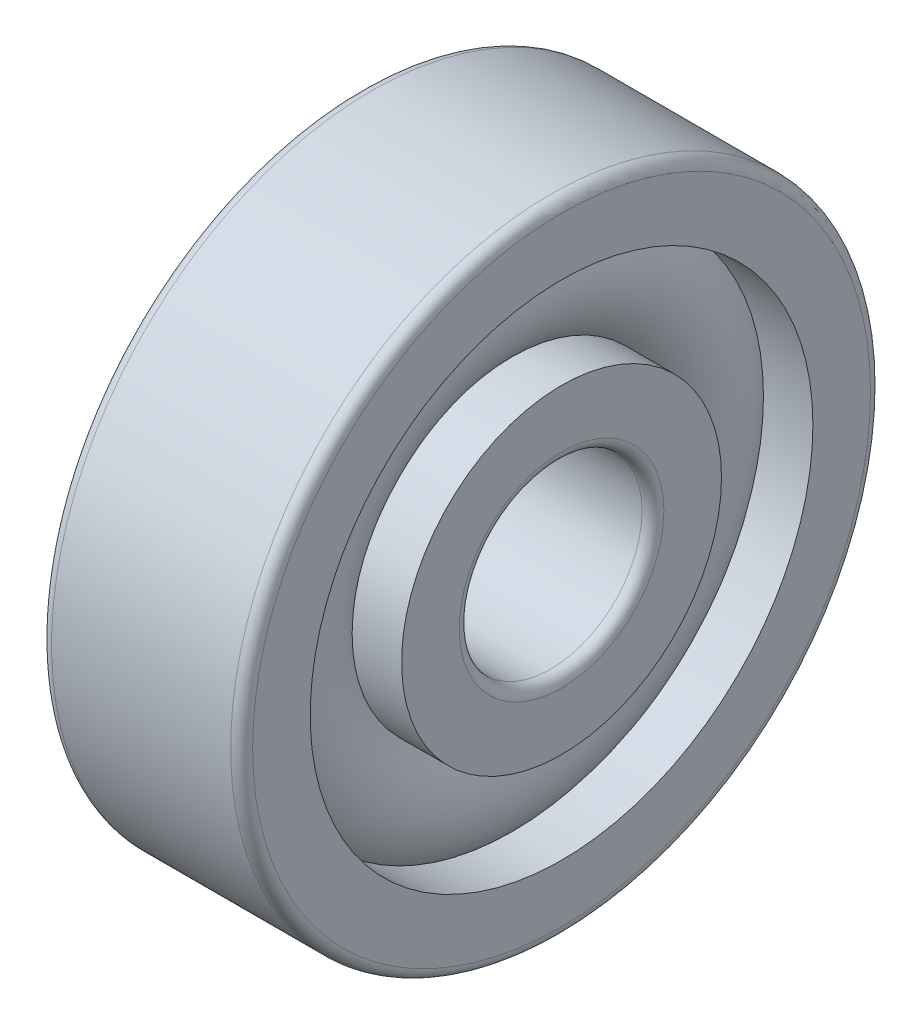
ISO-10303-21;
HEADER;
FILE_DESCRIPTION(('STEP AP214'),'2;1');
FILE_NAME('part.step','',(''),(''),'','','');
FILE_SCHEMA(('AUTOMOTIVE_DESIGN { 1 0 10303 214 1 1 1 1 }'));
ENDSEC;
DATA;
#1=APPLICATION_CONTEXT('core data for automotive mechanical design processes');
#2=APPLICATION_PROTOCOL_DEFINITION('international standard','automotive_design',2000,#1);
#3=PRODUCT_CONTEXT('',#1,'mechanical');
#4=PRODUCT('Part','Part','',(#3));
#5=PRODUCT_RELATED_PRODUCT_CATEGORY('part','',(#4));
#6=PRODUCT_DEFINITION_FORMATION('','',#4);
#7=PRODUCT_DEFINITION_CONTEXT('part definition',#1,'design');
#8=PRODUCT_DEFINITION('design','',#6,#7);
#9=PRODUCT_DEFINITION_SHAPE('','',#8);
#10=(LENGTH_UNIT() NAMED_UNIT(*) SI_UNIT(.MILLI.,.METRE.));
#11=(NAMED_UNIT(*) PLANE_ANGLE_UNIT() SI_UNIT($,.RADIAN.));
#12=(NAMED_UNIT(*) SI_UNIT($,.STERADIAN.) SOLID_ANGLE_UNIT());
#13=UNCERTAINTY_MEASURE_WITH_UNIT(LENGTH_MEASURE(1.E-05),#10,'distance_accuracy_value','');
#14=(GEOMETRIC_REPRESENTATION_CONTEXT(3) GLOBAL_UNCERTAINTY_ASSIGNED_CONTEXT((#13)) GLOBAL_UNIT_ASSIGNED_CONTEXT((#10,
#11,#12)) REPRESENTATION_CONTEXT('',''));
#15=CARTESIAN_POINT('',(0.,0.,0.));
#16=DIRECTION('',(0.,0.,1.));
#17=DIRECTION('',(1.,0.,0.));
#18=AXIS2_PLACEMENT_3D('',#15,#16,#17);
#19=CARTESIAN_POINT('',(0.,0.,0.));
#20=DIRECTION('',(-1.,0.,0.));
#21=DIRECTION('',(0.,0.,1.));
#22=AXIS2_PLACEMENT_3D('',#19,#20,#21);
#23=TOROIDAL_SURFACE('',#22,11.25,3.75);
#24=CARTESIAN_POINT('',(2.79508497187473,0.,0.));
#25=DIRECTION('',(-1.,0.,0.));
#26=DIRECTION('',(0.,0.,1.));
#27=AXIS2_PLACEMENT_3D('',#24,#25,#26);
#28=CIRCLE('',#27,13.75);
#29=CARTESIAN_POINT('',(2.79508497187473,0.,13.75));
#30=VERTEX_POINT('',#29);
#31=EDGE_CURVE('E41',#30,#30,#28,.F.);
#32=ORIENTED_EDGE('',*,*,#31,.T.);
#33=EDGE_LOOP('',(#32));
#34=FACE_BOUND('',#33,.T.);
#35=CARTESIAN_POINT('',(2.79508497187474,0.,0.));
#36=DIRECTION('',(-1.,0.,0.));
#37=DIRECTION('',(0.,0.,1.));
#38=AXIS2_PLACEMENT_3D('',#35,#36,#37);
#39=CIRCLE('',#38,8.75);
#40=CARTESIAN_POINT('',(2.79508497187474,0.,8.75));
#41=VERTEX_POINT('',#40);
#42=EDGE_CURVE('E10',#41,#41,#39,.T.);
#43=ORIENTED_EDGE('',*,*,#42,.T.);
#44=EDGE_LOOP('',(#43));
#45=FACE_BOUND('',#44,.T.);
#46=ADVANCED_FACE('F37',(#34,#45),#23,.T.);
#47=CARTESIAN_POINT('',(-20.6375,0.,0.));
#48=DIRECTION('',(1.,0.,0.));
#49=DIRECTION('',(0.,0.,-1.));
#50=AXIS2_PLACEMENT_3D('',#47,#48,#49);
#51=CYLINDRICAL_SURFACE('',#50,8.75);
#52=CARTESIAN_POINT('',(5.5,0.,0.));
#53=DIRECTION('',(1.,0.,0.));
#54=DIRECTION('',(0.,0.,-1.));
#55=AXIS2_PLACEMENT_3D('',#52,#53,#54);
#56=CIRCLE('',#55,8.75);
#57=CARTESIAN_POINT('',(5.5,0.,-8.75));
#58=VERTEX_POINT('',#57);
#59=EDGE_CURVE('E52',#58,#58,#56,.T.);
#60=ORIENTED_EDGE('',*,*,#59,.F.);
#61=EDGE_LOOP('',(#60));
#62=FACE_BOUND('',#61,.T.);
#63=ORIENTED_EDGE('',*,*,#42,.F.);
#64=EDGE_LOOP('',(#63));
#65=FACE_BOUND('',#64,.T.);
#66=ADVANCED_FACE('F101',(#62,#65),#51,.T.);
#67=CARTESIAN_POINT('',(-20.6375,0.,0.));
#68=DIRECTION('',(1.,0.,0.));
#69=DIRECTION('',(0.,0.,-1.));
#70=AXIS2_PLACEMENT_3D('',#67,#68,#69);
#71=CYLINDRICAL_SURFACE('',#70,8.75);
#72=CARTESIAN_POINT('',(-5.5,0.,0.));
#73=DIRECTION('',(1.,0.,0.));
#74=DIRECTION('',(0.,0.,-1.));
#75=AXIS2_PLACEMENT_3D('',#72,#73,#74);
#76=CIRCLE('',#75,8.75);
#77=CARTESIAN_POINT('',(-5.5,0.,-8.75));
#78=VERTEX_POINT('',#77);
#79=EDGE_CURVE('E64',#78,#78,#76,.T.);
#80=ORIENTED_EDGE('',*,*,#79,.T.);
#81=EDGE_LOOP('',(#80));
#82=FACE_BOUND('',#81,.T.);
#83=CARTESIAN_POINT('',(-2.79508497187474,0.,0.));
#84=DIRECTION('',(1.,0.,0.));
#85=DIRECTION('',(0.,0.,-1.));
#86=AXIS2_PLACEMENT_3D('',#83,#84,#85);
#87=CIRCLE('',#86,8.75);
#88=CARTESIAN_POINT('',(-2.79508497187474,0.,-8.75));
#89=VERTEX_POINT('',#88);
#90=EDGE_CURVE('E46',#89,#89,#87,.T.);
#91=ORIENTED_EDGE('',*,*,#90,.F.);
#92=EDGE_LOOP('',(#91));
#93=FACE_BOUND('',#92,.T.);
#94=ADVANCED_FACE('F104',(#82,#93),#71,.T.);
#95=CARTESIAN_POINT('',(5.5,5.6,0.));
#96=DIRECTION('',(1.,0.,0.));
#97=DIRECTION('',(0.,0.,-1.));
#98=AXIS2_PLACEMENT_3D('',#95,#96,#97);
#99=PLANE('',#98);
#100=ORIENTED_EDGE('',*,*,#59,.T.);
#101=EDGE_LOOP('',(#100));
#102=FACE_BOUND('',#101,.T.);
#103=CARTESIAN_POINT('',(5.5,0.,0.));
#104=DIRECTION('',(1.,0.,0.));
#105=DIRECTION('',(0.,0.,-1.));
#106=AXIS2_PLACEMENT_3D('',#103,#104,#105);
#107=CIRCLE('',#106,5.6);
#108=CARTESIAN_POINT('',(5.5,0.,-5.6));
#109=VERTEX_POINT('',#108);
#110=EDGE_CURVE('E91',#109,#109,#107,.T.);
#111=ORIENTED_EDGE('',*,*,#110,.F.);
#112=EDGE_LOOP('',(#111));
#113=FACE_BOUND('',#112,.T.);
#114=ADVANCED_FACE('F98',(#102,#113),#99,.T.);
#115=CARTESIAN_POINT('',(4.9,0.,0.));
#116=DIRECTION('',(1.,0.,0.));
#117=DIRECTION('',(0.,0.,-1.));
#118=AXIS2_PLACEMENT_3D('',#115,#116,#117);
#119=TOROIDAL_SURFACE('',#118,5.6,0.599999999999999);
#120=ORIENTED_EDGE('',*,*,#110,.T.);
#121=EDGE_LOOP('',(#120));
#122=FACE_BOUND('',#121,.T.);
#123=CARTESIAN_POINT('',(4.9,0.,0.));
#124=DIRECTION('',(1.,0.,0.));
#125=DIRECTION('',(0.,0.,-1.));
#126=AXIS2_PLACEMENT_3D('',#123,#124,#125);
#127=CIRCLE('',#126,5.);
#128=CARTESIAN_POINT('',(4.9,0.,-5.));
#129=VERTEX_POINT('',#128);
#130=EDGE_CURVE('E87',#129,#129,#127,.T.);
#131=ORIENTED_EDGE('',*,*,#130,.F.);
#132=EDGE_LOOP('',(#131));
#133=FACE_BOUND('',#132,.T.);
#134=ADVANCED_FACE('F115',(#122,#133),#119,.T.);
#135=CARTESIAN_POINT('',(-20.6375,0.,0.));
#136=DIRECTION('',(1.,0.,0.));
#137=DIRECTION('',(0.,0.,-1.));
#138=AXIS2_PLACEMENT_3D('',#135,#136,#137);
#139=CYLINDRICAL_SURFACE('',#138,5.);
#140=ORIENTED_EDGE('',*,*,#130,.T.);
#141=EDGE_LOOP('',(#140));
#142=FACE_BOUND('',#141,.T.);
#143=CARTESIAN_POINT('',(-4.9,0.,0.));
#144=DIRECTION('',(1.,0.,0.));
#145=DIRECTION('',(0.,0.,-1.));
#146=AXIS2_PLACEMENT_3D('',#143,#144,#145);
#147=CIRCLE('',#146,5.);
#148=CARTESIAN_POINT('',(-4.9,0.,-5.));
#149=VERTEX_POINT('',#148);
#150=EDGE_CURVE('E83',#149,#149,#147,.T.);
#151=ORIENTED_EDGE('',*,*,#150,.F.);
#152=EDGE_LOOP('',(#151));
#153=FACE_BOUND('',#152,.T.);
#154=ADVANCED_FACE('F118',(#142,#153),#139,.F.);
#155=CARTESIAN_POINT('',(-4.9,0.,0.));
#156=DIRECTION('',(1.,0.,0.));
#157=DIRECTION('',(0.,0.,-1.));
#158=AXIS2_PLACEMENT_3D('',#155,#156,#157);
#159=TOROIDAL_SURFACE('',#158,5.6,0.599999999999999);
#160=ORIENTED_EDGE('',*,*,#150,.T.);
#161=EDGE_LOOP('',(#160));
#162=FACE_BOUND('',#161,.T.);
#163=CARTESIAN_POINT('',(-5.5,0.,0.));
#164=DIRECTION('',(1.,0.,0.));
#165=DIRECTION('',(0.,0.,-1.));
#166=AXIS2_PLACEMENT_3D('',#163,#164,#165);
#167=CIRCLE('',#166,5.6);
#168=CARTESIAN_POINT('',(-5.5,0.,-5.6));
#169=VERTEX_POINT('',#168);
#170=EDGE_CURVE('E79',#169,#169,#167,.T.);
#171=ORIENTED_EDGE('',*,*,#170,.F.);
#172=EDGE_LOOP('',(#171));
#173=FACE_BOUND('',#172,.T.);
#174=ADVANCED_FACE('F122',(#162,#173),#159,.T.);
#175=CARTESIAN_POINT('',(-5.5,8.75,0.));
#176=DIRECTION('',(-1.,0.,0.));
#177=DIRECTION('',(0.,0.,1.));
#178=AXIS2_PLACEMENT_3D('',#175,#176,#177);
#179=PLANE('',#178);
#180=ORIENTED_EDGE('',*,*,#170,.T.);
#181=EDGE_LOOP('',(#180));
#182=FACE_BOUND('',#181,.T.);
#183=ORIENTED_EDGE('',*,*,#79,.F.);
#184=EDGE_LOOP('',(#183));
#185=FACE_BOUND('',#184,.T.);
#186=ADVANCED_FACE('F126',(#182,#185),#179,.T.);
#187=CARTESIAN_POINT('',(-2.79508497187473,0.,0.));
#188=DIRECTION('',(1.,0.,0.));
#189=DIRECTION('',(0.,0.,-1.));
#190=AXIS2_PLACEMENT_3D('',#187,#188,#189);
#191=CIRCLE('',#190,13.75);
#192=CARTESIAN_POINT('',(-2.79508497187473,0.,-13.75));
#193=VERTEX_POINT('',#192);
#194=EDGE_CURVE('E55',#193,#193,#191,.F.);
#195=ORIENTED_EDGE('',*,*,#194,.T.);
#196=EDGE_LOOP('',(#195));
#197=FACE_BOUND('',#196,.T.);
#198=ORIENTED_EDGE('',*,*,#90,.T.);
#199=EDGE_LOOP('',(#198));
#200=FACE_BOUND('',#199,.T.);
#201=ADVANCED_FACE('F39',(#197,#200),#23,.T.);
#202=CARTESIAN_POINT('',(-20.6375,0.,0.));
#203=DIRECTION('',(1.,0.,0.));
#204=DIRECTION('',(0.,0.,-1.));
#205=AXIS2_PLACEMENT_3D('',#202,#203,#204);
#206=CYLINDRICAL_SURFACE('',#205,13.75);
#207=CARTESIAN_POINT('',(5.5,0.,0.));
#208=DIRECTION('',(1.,0.,0.));
#209=DIRECTION('',(0.,0.,-1.));
#210=AXIS2_PLACEMENT_3D('',#207,#208,#209);
#211=CIRCLE('',#210,13.75);
#212=CARTESIAN_POINT('',(5.5,0.,-13.75));
#213=VERTEX_POINT('',#212);
#214=EDGE_CURVE('E58',#213,#213,#211,.T.);
#215=ORIENTED_EDGE('',*,*,#214,.T.);
#216=EDGE_LOOP('',(#215));
#217=FACE_BOUND('',#216,.T.);
#218=ORIENTED_EDGE('',*,*,#31,.F.);
#219=EDGE_LOOP('',(#218));
#220=FACE_BOUND('',#219,.T.);
#221=ADVANCED_FACE('F131',(#217,#220),#206,.F.);
#222=CARTESIAN_POINT('',(-20.6375,0.,0.));
#223=DIRECTION('',(1.,0.,0.));
#224=DIRECTION('',(0.,0.,-1.));
#225=AXIS2_PLACEMENT_3D('',#222,#223,#224);
#226=CYLINDRICAL_SURFACE('',#225,13.75);
#227=CARTESIAN_POINT('',(-5.5,0.,0.));
#228=DIRECTION('',(1.,0.,0.));
#229=DIRECTION('',(0.,0.,-1.));
#230=AXIS2_PLACEMENT_3D('',#227,#228,#229);
#231=CIRCLE('',#230,13.75);
#232=CARTESIAN_POINT('',(-5.5,0.,-13.75));
#233=VERTEX_POINT('',#232);
#234=EDGE_CURVE('E162',#233,#233,#231,.T.);
#235=ORIENTED_EDGE('',*,*,#234,.F.);
#236=EDGE_LOOP('',(#235));
#237=FACE_BOUND('',#236,.T.);
#238=ORIENTED_EDGE('',*,*,#194,.F.);
#239=EDGE_LOOP('',(#238));
#240=FACE_BOUND('',#239,.T.);
#241=ADVANCED_FACE('F134',(#237,#240),#226,.F.);
#242=CARTESIAN_POINT('',(5.5,16.9,0.));
#243=DIRECTION('',(1.,0.,0.));
#244=DIRECTION('',(0.,0.,-1.));
#245=AXIS2_PLACEMENT_3D('',#242,#243,#244);
#246=PLANE('',#245);
#247=CARTESIAN_POINT('',(5.5,0.,0.));
#248=DIRECTION('',(1.,0.,0.));
#249=DIRECTION('',(0.,0.,-1.));
#250=AXIS2_PLACEMENT_3D('',#247,#248,#249);
#251=CIRCLE('',#250,16.9);
#252=CARTESIAN_POINT('',(5.5,0.,-16.9));
#253=VERTEX_POINT('',#252);
#254=EDGE_CURVE('E66',#253,#253,#251,.T.);
#255=ORIENTED_EDGE('',*,*,#254,.T.);
#256=EDGE_LOOP('',(#255));
#257=FACE_BOUND('',#256,.T.);
#258=ORIENTED_EDGE('',*,*,#214,.F.);
#259=EDGE_LOOP('',(#258));
#260=FACE_BOUND('',#259,.T.);
#261=ADVANCED_FACE('F135',(#257,#260),#246,.T.);
#262=CARTESIAN_POINT('',(4.9,0.,0.));
#263=DIRECTION('',(1.,0.,0.));
#264=DIRECTION('',(0.,0.,-1.));
#265=AXIS2_PLACEMENT_3D('',#262,#263,#264);
#266=TOROIDAL_SURFACE('',#265,16.9,0.600000000000003);
#267=CARTESIAN_POINT('',(4.9,0.,0.));
#268=DIRECTION('',(1.,0.,0.));
#269=DIRECTION('',(0.,0.,-1.));
#270=AXIS2_PLACEMENT_3D('',#267,#268,#269);
#271=CIRCLE('',#270,17.5);
#272=CARTESIAN_POINT('',(4.9,0.,-17.5));
#273=VERTEX_POINT('',#272);
#274=EDGE_CURVE('E72',#273,#273,#271,.T.);
#275=ORIENTED_EDGE('',*,*,#274,.T.);
#276=EDGE_LOOP('',(#275));
#277=FACE_BOUND('',#276,.T.);
#278=ORIENTED_EDGE('',*,*,#254,.F.);
#279=EDGE_LOOP('',(#278));
#280=FACE_BOUND('',#279,.T.);
#281=ADVANCED_FACE('F138',(#277,#280),#266,.T.);
#282=CARTESIAN_POINT('',(-20.6375,0.,0.));
#283=DIRECTION('',(1.,0.,0.));
#284=DIRECTION('',(0.,0.,-1.));
#285=AXIS2_PLACEMENT_3D('',#282,#283,#284);
#286=CYLINDRICAL_SURFACE('',#285,17.5);
#287=CARTESIAN_POINT('',(-4.9,0.,0.));
#288=DIRECTION('',(1.,0.,0.));
#289=DIRECTION('',(0.,0.,-1.));
#290=AXIS2_PLACEMENT_3D('',#287,#288,#289);
#291=CIRCLE('',#290,17.5);
#292=CARTESIAN_POINT('',(-4.9,0.,-17.5));
#293=VERTEX_POINT('',#292);
#294=EDGE_CURVE('E168',#293,#293,#291,.T.);
#295=ORIENTED_EDGE('',*,*,#294,.T.);
#296=EDGE_LOOP('',(#295));
#297=FACE_BOUND('',#296,.T.);
#298=ORIENTED_EDGE('',*,*,#274,.F.);
#299=EDGE_LOOP('',(#298));
#300=FACE_BOUND('',#299,.T.);
#301=ADVANCED_FACE('F142',(#297,#300),#286,.T.);
#302=CARTESIAN_POINT('',(-4.9,0.,0.));
#303=DIRECTION('',(1.,0.,0.));
#304=DIRECTION('',(0.,0.,-1.));
#305=AXIS2_PLACEMENT_3D('',#302,#303,#304);
#306=TOROIDAL_SURFACE('',#305,16.9,0.600000000000003);
#307=CARTESIAN_POINT('',(-5.5,0.,0.));
#308=DIRECTION('',(1.,0.,0.));
#309=DIRECTION('',(0.,0.,-1.));
#310=AXIS2_PLACEMENT_3D('',#307,#308,#309);
#311=CIRCLE('',#310,16.9);
#312=CARTESIAN_POINT('',(-5.5,0.,-16.9));
#313=VERTEX_POINT('',#312);
#314=EDGE_CURVE('E164',#313,#313,#311,.T.);
#315=ORIENTED_EDGE('',*,*,#314,.T.);
#316=EDGE_LOOP('',(#315));
#317=FACE_BOUND('',#316,.T.);
#318=ORIENTED_EDGE('',*,*,#294,.F.);
#319=EDGE_LOOP('',(#318));
#320=FACE_BOUND('',#319,.T.);
#321=ADVANCED_FACE('F146',(#317,#320),#306,.T.);
#322=CARTESIAN_POINT('',(-5.5,13.75,0.));
#323=DIRECTION('',(-1.,0.,0.));
#324=DIRECTION('',(0.,0.,1.));
#325=AXIS2_PLACEMENT_3D('',#322,#323,#324);
#326=PLANE('',#325);
#327=ORIENTED_EDGE('',*,*,#234,.T.);
#328=EDGE_LOOP('',(#327));
#329=FACE_BOUND('',#328,.T.);
#330=ORIENTED_EDGE('',*,*,#314,.F.);
#331=EDGE_LOOP('',(#330));
#332=FACE_BOUND('',#331,.T.);
#333=ADVANCED_FACE('F150',(#329,#332),#326,.T.);
#334=CLOSED_SHELL('',(#46,#66,#94,#114,#134,#154,#174,#186,#201,#221,#241,#261,#281,#301,#321,#333));
#335=MANIFOLD_SOLID_BREP('B2',#334);
#336=ADVANCED_BREP_SHAPE_REPRESENTATION('',(#18,#335),#14);
#337=SHAPE_DEFINITION_REPRESENTATION(#9,#336);
ENDSEC;
END-ISO-10303-21;
